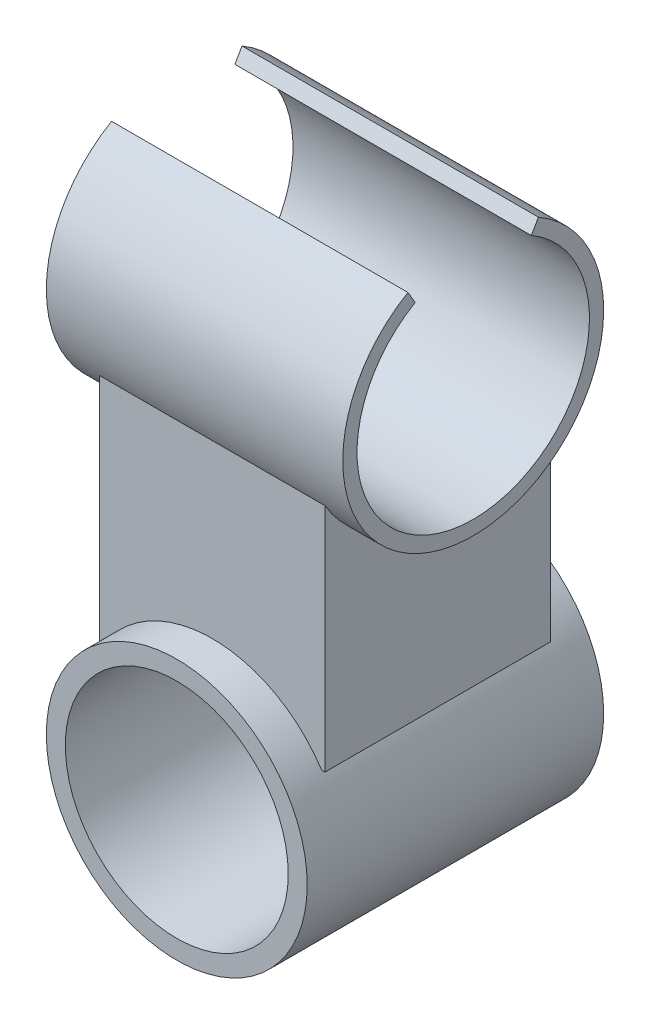
ISO-10303-21;
HEADER;
FILE_DESCRIPTION(('STEP AP214'),'2;1');
FILE_NAME('part.step','',(''),(''),'','','');
FILE_SCHEMA(('AUTOMOTIVE_DESIGN { 1 0 10303 214 1 1 1 1 }'));
ENDSEC;
DATA;
#1=APPLICATION_CONTEXT('core data for automotive mechanical design processes');
#2=APPLICATION_PROTOCOL_DEFINITION('international standard','automotive_design',2000,#1);
#3=PRODUCT_CONTEXT('',#1,'mechanical');
#4=PRODUCT('Part','Part','',(#3));
#5=PRODUCT_RELATED_PRODUCT_CATEGORY('part','',(#4));
#6=PRODUCT_DEFINITION_FORMATION('','',#4);
#7=PRODUCT_DEFINITION_CONTEXT('part definition',#1,'design');
#8=PRODUCT_DEFINITION('design','',#6,#7);
#9=PRODUCT_DEFINITION_SHAPE('','',#8);
#10=(LENGTH_UNIT() NAMED_UNIT(*) SI_UNIT(.MILLI.,.METRE.));
#11=(NAMED_UNIT(*) PLANE_ANGLE_UNIT() SI_UNIT($,.RADIAN.));
#12=(NAMED_UNIT(*) SI_UNIT($,.STERADIAN.) SOLID_ANGLE_UNIT());
#13=UNCERTAINTY_MEASURE_WITH_UNIT(LENGTH_MEASURE(1.E-05),#10,'distance_accuracy_value','');
#14=(GEOMETRIC_REPRESENTATION_CONTEXT(3) GLOBAL_UNCERTAINTY_ASSIGNED_CONTEXT((#13)) GLOBAL_UNIT_ASSIGNED_CONTEXT((#10,
#11,#12)) REPRESENTATION_CONTEXT('',''));
#15=CARTESIAN_POINT('',(0.,0.,0.));
#16=DIRECTION('',(0.,0.,1.));
#17=DIRECTION('',(1.,0.,0.));
#18=AXIS2_PLACEMENT_3D('',#15,#16,#17);
#19=CARTESIAN_POINT('',(0.,-25.,0.));
#20=DIRECTION('',(0.,-1.,0.));
#21=DIRECTION('',(0.,0.,-1.));
#22=AXIS2_PLACEMENT_3D('',#19,#20,#21);
#23=PLANE('',#22);
#24=DIRECTION('',(-1.,0.,0.));
#25=VECTOR('',#24,1.);
#26=CARTESIAN_POINT('',(-9.5,-25.,-9.5));
#27=LINE('',#26,#25);
#28=CARTESIAN_POINT('',(-9.21954445729289,-25.,-9.5));
#29=VERTEX_POINT('',#28);
#30=CARTESIAN_POINT('',(-9.5,-25.,-9.5));
#31=VERTEX_POINT('',#30);
#32=EDGE_CURVE('E334',#29,#31,#27,.T.);
#33=ORIENTED_EDGE('',*,*,#32,.F.);
#34=DIRECTION('',(0.,0.,-1.));
#35=VECTOR('',#34,1.);
#36=CARTESIAN_POINT('',(-9.21954445729289,-25.,12.5));
#37=LINE('',#36,#35);
#38=CARTESIAN_POINT('',(-9.21954445729289,-25.,9.5));
#39=VERTEX_POINT('',#38);
#40=EDGE_CURVE('E11',#29,#39,#37,.F.);
#41=ORIENTED_EDGE('',*,*,#40,.T.);
#42=DIRECTION('',(1.,0.,0.));
#43=VECTOR('',#42,1.);
#44=CARTESIAN_POINT('',(-9.5,-25.,9.5));
#45=LINE('',#44,#43);
#46=CARTESIAN_POINT('',(-9.5,-25.,9.5));
#47=VERTEX_POINT('',#46);
#48=EDGE_CURVE('E168',#47,#39,#45,.T.);
#49=ORIENTED_EDGE('',*,*,#48,.F.);
#50=DIRECTION('',(0.,0.,1.));
#51=VECTOR('',#50,1.);
#52=CARTESIAN_POINT('',(-9.5,-25.,9.5));
#53=LINE('',#52,#51);
#54=EDGE_CURVE('E177',#31,#47,#53,.T.);
#55=ORIENTED_EDGE('',*,*,#54,.F.);
#56=EDGE_LOOP('',(#33,#41,#49,#55));
#57=FACE_BOUND('',#56,.T.);
#58=ADVANCED_FACE('F46',(#57),#23,.T.);
#59=CARTESIAN_POINT('',(9.21954445729289,-25.,9.5));
#60=VERTEX_POINT('',#59);
#61=CARTESIAN_POINT('',(9.5,-25.,9.5));
#62=VERTEX_POINT('',#61);
#63=EDGE_CURVE('E165',#60,#62,#45,.T.);
#64=ORIENTED_EDGE('',*,*,#63,.F.);
#65=DIRECTION('',(0.,0.,-1.));
#66=VECTOR('',#65,1.);
#67=CARTESIAN_POINT('',(9.21954445729289,-25.,12.5));
#68=LINE('',#67,#66);
#69=CARTESIAN_POINT('',(9.21954445729289,-25.,-9.5));
#70=VERTEX_POINT('',#69);
#71=EDGE_CURVE('E56',#60,#70,#68,.T.);
#72=ORIENTED_EDGE('',*,*,#71,.T.);
#73=CARTESIAN_POINT('',(9.5,-25.,-9.5));
#74=VERTEX_POINT('',#73);
#75=EDGE_CURVE('E183',#74,#70,#27,.T.);
#76=ORIENTED_EDGE('',*,*,#75,.F.);
#77=DIRECTION('',(0.,0.,-1.));
#78=VECTOR('',#77,1.);
#79=CARTESIAN_POINT('',(9.5,-25.,9.5));
#80=LINE('',#79,#78);
#81=EDGE_CURVE('E175',#62,#74,#80,.T.);
#82=ORIENTED_EDGE('',*,*,#81,.F.);
#83=EDGE_LOOP('',(#64,#72,#76,#82));
#84=FACE_BOUND('',#83,.T.);
#85=ADVANCED_FACE('F173',(#84),#23,.T.);
#86=CARTESIAN_POINT('',(12.5,0.,0.));
#87=DIRECTION('',(-1.,0.,0.));
#88=DIRECTION('',(0.,0.,1.));
#89=AXIS2_PLACEMENT_3D('',#86,#87,#88);
#90=CYLINDRICAL_SURFACE('',#89,11.);
#91=DIRECTION('',(-1.,0.,0.));
#92=VECTOR('',#91,1.);
#93=CARTESIAN_POINT('',(12.5,-5.54526825320471,9.5));
#94=LINE('',#93,#92);
#95=CARTESIAN_POINT('',(-9.5,-5.54526825320471,9.5));
#96=VERTEX_POINT('',#95);
#97=CARTESIAN_POINT('',(9.5,-5.54526825320471,9.5));
#98=VERTEX_POINT('',#97);
#99=EDGE_CURVE('E224',#96,#98,#94,.F.);
#100=ORIENTED_EDGE('',*,*,#99,.T.);
#101=CARTESIAN_POINT('',(9.5,0.,0.));
#102=DIRECTION('',(1.,0.,0.));
#103=DIRECTION('',(0.,0.,-1.));
#104=AXIS2_PLACEMENT_3D('',#101,#102,#103);
#105=CIRCLE('',#104,11.);
#106=CARTESIAN_POINT('',(9.5,-5.54526825320471,-9.5));
#107=VERTEX_POINT('',#106);
#108=EDGE_CURVE('E228',#98,#107,#105,.T.);
#109=ORIENTED_EDGE('',*,*,#108,.T.);
#110=DIRECTION('',(-1.,0.,0.));
#111=VECTOR('',#110,1.);
#112=CARTESIAN_POINT('',(12.5,-5.54526825320471,-9.5));
#113=LINE('',#112,#111);
#114=CARTESIAN_POINT('',(-9.5,-5.54526825320471,-9.5));
#115=VERTEX_POINT('',#114);
#116=EDGE_CURVE('E216',#107,#115,#113,.T.);
#117=ORIENTED_EDGE('',*,*,#116,.T.);
#118=CARTESIAN_POINT('',(-9.5,0.,0.));
#119=DIRECTION('',(-1.,0.,0.));
#120=DIRECTION('',(0.,0.,1.));
#121=AXIS2_PLACEMENT_3D('',#118,#119,#120);
#122=CIRCLE('',#121,11.);
#123=EDGE_CURVE('E220',#115,#96,#122,.T.);
#124=ORIENTED_EDGE('',*,*,#123,.T.);
#125=EDGE_LOOP('',(#100,#109,#117,#124));
#126=FACE_BOUND('',#125,.T.);
#127=CARTESIAN_POINT('',(-12.5,0.,0.));
#128=DIRECTION('',(1.,0.,0.));
#129=DIRECTION('',(0.,0.,-1.));
#130=AXIS2_PLACEMENT_3D('',#127,#128,#129);
#131=CIRCLE('',#130,11.);
#132=CARTESIAN_POINT('',(-12.5,9.52627944162886,5.49999999999994));
#133=VERTEX_POINT('',#132);
#134=CARTESIAN_POINT('',(-12.5,9.52627944162882,-5.50000000000001));
#135=VERTEX_POINT('',#134);
#136=EDGE_CURVE('E232',#133,#135,#131,.T.);
#137=ORIENTED_EDGE('',*,*,#136,.T.);
#138=DIRECTION('',(-1.,0.,0.));
#139=VECTOR('',#138,1.);
#140=CARTESIAN_POINT('',(12.5,9.52627944162882,-5.50000000000001));
#141=LINE('',#140,#139);
#142=CARTESIAN_POINT('',(12.5,9.52627944162882,-5.50000000000001));
#143=VERTEX_POINT('',#142);
#144=EDGE_CURVE('E160',#143,#135,#141,.T.);
#145=ORIENTED_EDGE('',*,*,#144,.F.);
#146=CARTESIAN_POINT('',(12.5,0.,0.));
#147=DIRECTION('',(1.,0.,0.));
#148=DIRECTION('',(0.,0.,-1.));
#149=AXIS2_PLACEMENT_3D('',#146,#147,#148);
#150=CIRCLE('',#149,11.);
#151=CARTESIAN_POINT('',(12.5,9.52627944162886,5.49999999999994));
#152=VERTEX_POINT('',#151);
#153=EDGE_CURVE('E233',#152,#143,#150,.T.);
#154=ORIENTED_EDGE('',*,*,#153,.F.);
#155=DIRECTION('',(-1.,0.,0.));
#156=VECTOR('',#155,1.);
#157=CARTESIAN_POINT('',(12.5,9.52627944162886,5.49999999999994));
#158=LINE('',#157,#156);
#159=EDGE_CURVE('E247',#152,#133,#158,.T.);
#160=ORIENTED_EDGE('',*,*,#159,.T.);
#161=EDGE_LOOP('',(#137,#145,#154,#160));
#162=FACE_BOUND('',#161,.T.);
#163=ADVANCED_FACE('F48',(#126,#162),#90,.T.);
#164=CARTESIAN_POINT('',(12.5,8.48704895708749,-4.90000000000001));
#165=DIRECTION('',(0.,-0.500000000000001,-0.866025403784438));
#166=DIRECTION('',(0.,0.866025403784438,-0.500000000000001));
#167=AXIS2_PLACEMENT_3D('',#164,#165,#166);
#168=PLANE('',#167);
#169=DIRECTION('',(0.,-0.866025403784438,0.500000000000001));
#170=VECTOR('',#169,1.);
#171=CARTESIAN_POINT('',(-12.5,8.48704895708749,-4.90000000000001));
#172=LINE('',#171,#170);
#173=CARTESIAN_POINT('',(-12.5,8.48704895708749,-4.90000000000001));
#174=VERTEX_POINT('',#173);
#175=EDGE_CURVE('E251',#135,#174,#172,.T.);
#176=ORIENTED_EDGE('',*,*,#175,.T.);
#177=DIRECTION('',(-1.,0.,0.));
#178=VECTOR('',#177,1.);
#179=CARTESIAN_POINT('',(12.5,8.48704895708749,-4.90000000000001));
#180=LINE('',#179,#178);
#181=CARTESIAN_POINT('',(12.5,8.48704895708749,-4.90000000000001));
#182=VERTEX_POINT('',#181);
#183=EDGE_CURVE('E266',#182,#174,#180,.T.);
#184=ORIENTED_EDGE('',*,*,#183,.F.);
#185=DIRECTION('',(0.,-0.866025403784438,0.500000000000001));
#186=VECTOR('',#185,1.);
#187=CARTESIAN_POINT('',(12.5,8.48704895708749,-4.90000000000001));
#188=LINE('',#187,#186);
#189=EDGE_CURVE('E237',#143,#182,#188,.T.);
#190=ORIENTED_EDGE('',*,*,#189,.F.);
#191=ORIENTED_EDGE('',*,*,#144,.T.);
#192=EDGE_LOOP('',(#176,#184,#190,#191));
#193=FACE_BOUND('',#192,.T.);
#194=ADVANCED_FACE('F274',(#193),#168,.F.);
#195=CARTESIAN_POINT('',(12.5,0.,0.));
#196=DIRECTION('',(-1.,0.,0.));
#197=DIRECTION('',(0.,0.,1.));
#198=AXIS2_PLACEMENT_3D('',#195,#196,#197);
#199=CYLINDRICAL_SURFACE('',#198,9.8);
#200=CARTESIAN_POINT('',(-12.5,0.,0.));
#201=DIRECTION('',(-1.,0.,0.));
#202=DIRECTION('',(0.,0.,-1.));
#203=AXIS2_PLACEMENT_3D('',#200,#201,#202);
#204=CIRCLE('',#203,9.8);
#205=CARTESIAN_POINT('',(-12.5,8.48704895708753,4.89999999999995));
#206=VERTEX_POINT('',#205);
#207=EDGE_CURVE('E254',#174,#206,#204,.T.);
#208=ORIENTED_EDGE('',*,*,#207,.T.);
#209=DIRECTION('',(-1.,0.,0.));
#210=VECTOR('',#209,1.);
#211=CARTESIAN_POINT('',(12.5,8.48704895708753,4.89999999999995));
#212=LINE('',#211,#210);
#213=CARTESIAN_POINT('',(12.5,8.48704895708753,4.89999999999995));
#214=VERTEX_POINT('',#213);
#215=EDGE_CURVE('E262',#214,#206,#212,.T.);
#216=ORIENTED_EDGE('',*,*,#215,.F.);
#217=CARTESIAN_POINT('',(12.5,0.,0.));
#218=DIRECTION('',(-1.,0.,0.));
#219=DIRECTION('',(0.,0.,-1.));
#220=AXIS2_PLACEMENT_3D('',#217,#218,#219);
#221=CIRCLE('',#220,9.8);
#222=EDGE_CURVE('E241',#182,#214,#221,.T.);
#223=ORIENTED_EDGE('',*,*,#222,.F.);
#224=ORIENTED_EDGE('',*,*,#183,.T.);
#225=EDGE_LOOP('',(#208,#216,#223,#224));
#226=FACE_BOUND('',#225,.T.);
#227=ADVANCED_FACE('F286',(#226),#199,.F.);
#228=CARTESIAN_POINT('',(12.5,9.52627944162886,5.49999999999994));
#229=DIRECTION('',(0.,-0.499999999999994,0.866025403784442));
#230=DIRECTION('',(0.,-0.866025403784442,-0.499999999999995));
#231=AXIS2_PLACEMENT_3D('',#228,#229,#230);
#232=PLANE('',#231);
#233=DIRECTION('',(0.,0.866025403784442,0.499999999999994));
#234=VECTOR('',#233,1.);
#235=CARTESIAN_POINT('',(-12.5,9.52627944162886,5.49999999999994));
#236=LINE('',#235,#234);
#237=EDGE_CURVE('E238',#206,#133,#236,.T.);
#238=ORIENTED_EDGE('',*,*,#237,.T.);
#239=ORIENTED_EDGE('',*,*,#159,.F.);
#240=DIRECTION('',(0.,0.866025403784442,0.499999999999994));
#241=VECTOR('',#240,1.);
#242=CARTESIAN_POINT('',(12.5,9.52627944162886,5.49999999999994));
#243=LINE('',#242,#241);
#244=EDGE_CURVE('E244',#214,#152,#243,.T.);
#245=ORIENTED_EDGE('',*,*,#244,.F.);
#246=ORIENTED_EDGE('',*,*,#215,.T.);
#247=EDGE_LOOP('',(#238,#239,#245,#246));
#248=FACE_BOUND('',#247,.T.);
#249=ADVANCED_FACE('F290',(#248),#232,.F.);
#250=CARTESIAN_POINT('',(12.5,0.,0.));
#251=DIRECTION('',(1.,0.,0.));
#252=DIRECTION('',(0.,0.,-1.));
#253=AXIS2_PLACEMENT_3D('',#250,#251,#252);
#254=PLANE('',#253);
#255=ORIENTED_EDGE('',*,*,#153,.T.);
#256=ORIENTED_EDGE('',*,*,#189,.T.);
#257=ORIENTED_EDGE('',*,*,#222,.T.);
#258=ORIENTED_EDGE('',*,*,#244,.T.);
#259=EDGE_LOOP('',(#255,#256,#257,#258));
#260=FACE_BOUND('',#259,.T.);
#261=ADVANCED_FACE('F292',(#260),#254,.T.);
#262=CARTESIAN_POINT('',(-12.5,0.,0.));
#263=DIRECTION('',(1.,0.,0.));
#264=DIRECTION('',(0.,0.,-1.));
#265=AXIS2_PLACEMENT_3D('',#262,#263,#264);
#266=PLANE('',#265);
#267=ORIENTED_EDGE('',*,*,#136,.F.);
#268=ORIENTED_EDGE('',*,*,#237,.F.);
#269=ORIENTED_EDGE('',*,*,#207,.F.);
#270=ORIENTED_EDGE('',*,*,#175,.F.);
#271=EDGE_LOOP('',(#267,#268,#269,#270));
#272=FACE_BOUND('',#271,.T.);
#273=ADVANCED_FACE('F282',(#272),#266,.F.);
#274=CARTESIAN_POINT('',(9.5,-25.,9.5));
#275=DIRECTION('',(1.,0.,0.));
#276=DIRECTION('',(0.,0.,-1.));
#277=AXIS2_PLACEMENT_3D('',#274,#275,#276);
#278=PLANE('',#277);
#279=ORIENTED_EDGE('',*,*,#108,.F.);
#280=DIRECTION('',(0.,1.,0.));
#281=VECTOR('',#280,1.);
#282=CARTESIAN_POINT('',(9.5,-25.,9.5));
#283=LINE('',#282,#281);
#284=EDGE_CURVE('E187',#62,#98,#283,.T.);
#285=ORIENTED_EDGE('',*,*,#284,.F.);
#286=ORIENTED_EDGE('',*,*,#81,.T.);
#287=DIRECTION('',(0.,1.,0.));
#288=VECTOR('',#287,1.);
#289=CARTESIAN_POINT('',(9.5,-25.,-9.5));
#290=LINE('',#289,#288);
#291=EDGE_CURVE('E181',#74,#107,#290,.T.);
#292=ORIENTED_EDGE('',*,*,#291,.T.);
#293=EDGE_LOOP('',(#279,#285,#286,#292));
#294=FACE_BOUND('',#293,.T.);
#295=ADVANCED_FACE('F299',(#294),#278,.T.);
#296=CARTESIAN_POINT('',(-9.5,-25.,9.5));
#297=DIRECTION('',(0.,0.,1.));
#298=DIRECTION('',(1.,0.,0.));
#299=AXIS2_PLACEMENT_3D('',#296,#297,#298);
#300=PLANE('',#299);
#301=ORIENTED_EDGE('',*,*,#48,.T.);
#302=CARTESIAN_POINT('',(0.,-31.,9.5));
#303=DIRECTION('',(0.,0.,1.));
#304=DIRECTION('',(1.,0.,0.));
#305=AXIS2_PLACEMENT_3D('',#302,#303,#304);
#306=CIRCLE('',#305,11.);
#307=EDGE_CURVE('E152',#39,#60,#306,.F.);
#308=ORIENTED_EDGE('',*,*,#307,.T.);
#309=ORIENTED_EDGE('',*,*,#63,.T.);
#310=ORIENTED_EDGE('',*,*,#284,.T.);
#311=ORIENTED_EDGE('',*,*,#99,.F.);
#312=DIRECTION('',(0.,1.,0.));
#313=VECTOR('',#312,1.);
#314=CARTESIAN_POINT('',(-9.5,-25.,9.5));
#315=LINE('',#314,#313);
#316=EDGE_CURVE('E191',#47,#96,#315,.T.);
#317=ORIENTED_EDGE('',*,*,#316,.F.);
#318=EDGE_LOOP('',(#301,#308,#309,#310,#311,#317));
#319=FACE_BOUND('',#318,.T.);
#320=ADVANCED_FACE('F163',(#319),#300,.T.);
#321=CARTESIAN_POINT('',(-9.5,-25.,9.5));
#322=DIRECTION('',(-1.,0.,0.));
#323=DIRECTION('',(0.,0.,1.));
#324=AXIS2_PLACEMENT_3D('',#321,#322,#323);
#325=PLANE('',#324);
#326=ORIENTED_EDGE('',*,*,#123,.F.);
#327=DIRECTION('',(0.,1.,0.));
#328=VECTOR('',#327,1.);
#329=CARTESIAN_POINT('',(-9.5,-25.,-9.5));
#330=LINE('',#329,#328);
#331=EDGE_CURVE('E195',#31,#115,#330,.T.);
#332=ORIENTED_EDGE('',*,*,#331,.F.);
#333=ORIENTED_EDGE('',*,*,#54,.T.);
#334=ORIENTED_EDGE('',*,*,#316,.T.);
#335=EDGE_LOOP('',(#326,#332,#333,#334));
#336=FACE_BOUND('',#335,.T.);
#337=ADVANCED_FACE('F317',(#336),#325,.T.);
#338=CARTESIAN_POINT('',(-9.5,-25.,-9.5));
#339=DIRECTION('',(0.,0.,-1.));
#340=DIRECTION('',(-1.,0.,0.));
#341=AXIS2_PLACEMENT_3D('',#338,#339,#340);
#342=PLANE('',#341);
#343=ORIENTED_EDGE('',*,*,#75,.T.);
#344=CARTESIAN_POINT('',(0.,-31.,-9.5));
#345=DIRECTION('',(0.,0.,-1.));
#346=DIRECTION('',(-1.,0.,0.));
#347=AXIS2_PLACEMENT_3D('',#344,#345,#346);
#348=CIRCLE('',#347,11.);
#349=EDGE_CURVE('E154',#70,#29,#348,.F.);
#350=ORIENTED_EDGE('',*,*,#349,.T.);
#351=ORIENTED_EDGE('',*,*,#32,.T.);
#352=ORIENTED_EDGE('',*,*,#331,.T.);
#353=ORIENTED_EDGE('',*,*,#116,.F.);
#354=ORIENTED_EDGE('',*,*,#291,.F.);
#355=EDGE_LOOP('',(#343,#350,#351,#352,#353,#354));
#356=FACE_BOUND('',#355,.T.);
#357=ADVANCED_FACE('F320',(#356),#342,.T.);
#358=CARTESIAN_POINT('',(0.,-31.,12.5));
#359=DIRECTION('',(0.,0.,-1.));
#360=DIRECTION('',(-1.,0.,0.));
#361=AXIS2_PLACEMENT_3D('',#358,#359,#360);
#362=CYLINDRICAL_SURFACE('',#361,9.4);
#363=CARTESIAN_POINT('',(0.,-31.,12.5));
#364=DIRECTION('',(0.,0.,1.));
#365=DIRECTION('',(1.,0.,0.));
#366=AXIS2_PLACEMENT_3D('',#363,#364,#365);
#367=CIRCLE('',#366,9.4);
#368=CARTESIAN_POINT('',(9.4,-31.,12.5));
#369=VERTEX_POINT('',#368);
#370=EDGE_CURVE('E420',#369,#369,#367,.T.);
#371=ORIENTED_EDGE('',*,*,#370,.T.);
#372=EDGE_LOOP('',(#371));
#373=FACE_BOUND('',#372,.T.);
#374=CARTESIAN_POINT('',(0.,-31.,-12.5));
#375=DIRECTION('',(0.,0.,1.));
#376=DIRECTION('',(1.,0.,0.));
#377=AXIS2_PLACEMENT_3D('',#374,#375,#376);
#378=CIRCLE('',#377,9.4);
#379=CARTESIAN_POINT('',(9.4,-31.,-12.5));
#380=VERTEX_POINT('',#379);
#381=EDGE_CURVE('E422',#380,#380,#378,.T.);
#382=ORIENTED_EDGE('',*,*,#381,.F.);
#383=EDGE_LOOP('',(#382));
#384=FACE_BOUND('',#383,.T.);
#385=ADVANCED_FACE('F323',(#373,#384),#362,.F.);
#386=CARTESIAN_POINT('',(0.,-31.,12.5));
#387=DIRECTION('',(0.,0.,-1.));
#388=DIRECTION('',(-1.,0.,0.));
#389=AXIS2_PLACEMENT_3D('',#386,#387,#388);
#390=CYLINDRICAL_SURFACE('',#389,11.);
#391=ORIENTED_EDGE('',*,*,#40,.F.);
#392=ORIENTED_EDGE('',*,*,#349,.F.);
#393=ORIENTED_EDGE('',*,*,#71,.F.);
#394=ORIENTED_EDGE('',*,*,#307,.F.);
#395=EDGE_LOOP('',(#391,#392,#393,#394));
#396=FACE_BOUND('',#395,.T.);
#397=CARTESIAN_POINT('',(0.,-31.,12.5));
#398=DIRECTION('',(0.,0.,1.));
#399=DIRECTION('',(1.,0.,0.));
#400=AXIS2_PLACEMENT_3D('',#397,#398,#399);
#401=CIRCLE('',#400,11.);
#402=CARTESIAN_POINT('',(11.,-31.,12.5));
#403=VERTEX_POINT('',#402);
#404=EDGE_CURVE('E336',#403,#403,#401,.T.);
#405=ORIENTED_EDGE('',*,*,#404,.F.);
#406=EDGE_LOOP('',(#405));
#407=FACE_BOUND('',#406,.T.);
#408=CARTESIAN_POINT('',(0.,-31.,-12.5));
#409=DIRECTION('',(0.,0.,1.));
#410=DIRECTION('',(1.,0.,0.));
#411=AXIS2_PLACEMENT_3D('',#408,#409,#410);
#412=CIRCLE('',#411,11.);
#413=CARTESIAN_POINT('',(11.,-31.,-12.5));
#414=VERTEX_POINT('',#413);
#415=EDGE_CURVE('E340',#414,#414,#412,.T.);
#416=ORIENTED_EDGE('',*,*,#415,.T.);
#417=EDGE_LOOP('',(#416));
#418=FACE_BOUND('',#417,.T.);
#419=ADVANCED_FACE('F150',(#396,#407,#418),#390,.T.);
#420=CARTESIAN_POINT('',(0.,-31.,-12.5));
#421=DIRECTION('',(0.,0.,1.));
#422=DIRECTION('',(1.,0.,0.));
#423=AXIS2_PLACEMENT_3D('',#420,#421,#422);
#424=PLANE('',#423);
#425=ORIENTED_EDGE('',*,*,#415,.F.);
#426=EDGE_LOOP('',(#425));
#427=FACE_BOUND('',#426,.T.);
#428=ORIENTED_EDGE('',*,*,#381,.T.);
#429=EDGE_LOOP('',(#428));
#430=FACE_BOUND('',#429,.T.);
#431=ADVANCED_FACE('F399',(#427,#430),#424,.F.);
#432=CARTESIAN_POINT('',(0.,-31.,12.5));
#433=DIRECTION('',(0.,0.,1.));
#434=DIRECTION('',(1.,0.,0.));
#435=AXIS2_PLACEMENT_3D('',#432,#433,#434);
#436=PLANE('',#435);
#437=ORIENTED_EDGE('',*,*,#404,.T.);
#438=EDGE_LOOP('',(#437));
#439=FACE_BOUND('',#438,.T.);
#440=ORIENTED_EDGE('',*,*,#370,.F.);
#441=EDGE_LOOP('',(#440));
#442=FACE_BOUND('',#441,.T.);
#443=ADVANCED_FACE('F403',(#439,#442),#436,.T.);
#444=CLOSED_SHELL('',(#58,#85,#163,#194,#227,#249,#261,#273,#295,#320,#337,#357,#385,#419,#431,#443));
#445=CARTESIAN_POINT('',(0.,-31.,-7.9));
#446=DIRECTION('',(0.,0.,-1.));
#447=DIRECTION('',(-1.,0.,0.));
#448=AXIS2_PLACEMENT_3D('',#445,#446,#447);
#449=CIRCLE('',#448,11.);
#450=CARTESIAN_POINT('',(7.9,-23.3455895066962,-7.9));
#451=VERTEX_POINT('',#450);
#452=CARTESIAN_POINT('',(-7.9,-23.3455895066962,-7.9));
#453=VERTEX_POINT('',#452);
#454=EDGE_CURVE('E70',#451,#453,#449,.F.);
#455=ORIENTED_EDGE('',*,*,#454,.T.);
#456=DIRECTION('',(0.,0.,-1.));
#457=VECTOR('',#456,1.);
#458=CARTESIAN_POINT('',(-7.9,-23.3455895066962,12.5));
#459=LINE('',#458,#457);
#460=CARTESIAN_POINT('',(-7.9,-23.3455895066962,7.9));
#461=VERTEX_POINT('',#460);
#462=EDGE_CURVE('E63',#453,#461,#459,.F.);
#463=ORIENTED_EDGE('',*,*,#462,.T.);
#464=CARTESIAN_POINT('',(0.,-31.,7.9));
#465=DIRECTION('',(0.,0.,1.));
#466=DIRECTION('',(1.,0.,0.));
#467=AXIS2_PLACEMENT_3D('',#464,#465,#466);
#468=CIRCLE('',#467,11.);
#469=CARTESIAN_POINT('',(7.9,-23.3455895066962,7.9));
#470=VERTEX_POINT('',#469);
#471=EDGE_CURVE('E170',#461,#470,#468,.F.);
#472=ORIENTED_EDGE('',*,*,#471,.T.);
#473=DIRECTION('',(0.,0.,-1.));
#474=VECTOR('',#473,1.);
#475=CARTESIAN_POINT('',(7.9,-23.3455895066962,12.5));
#476=LINE('',#475,#474);
#477=EDGE_CURVE('E347',#470,#451,#476,.T.);
#478=ORIENTED_EDGE('',*,*,#477,.T.);
#479=EDGE_LOOP('',(#455,#463,#472,#478));
#480=FACE_BOUND('',#479,.T.);
#481=ADVANCED_FACE('F380',(#480),#390,.T.);
#482=CARTESIAN_POINT('',(-7.9,0.,0.));
#483=DIRECTION('',(-1.,0.,0.));
#484=DIRECTION('',(0.,0.,1.));
#485=AXIS2_PLACEMENT_3D('',#482,#483,#484);
#486=CIRCLE('',#485,11.);
#487=CARTESIAN_POINT('',(-7.9,-7.65441049330384,-7.9));
#488=VERTEX_POINT('',#487);
#489=CARTESIAN_POINT('',(-7.9,-7.65441049330384,7.9));
#490=VERTEX_POINT('',#489);
#491=EDGE_CURVE('E212',#488,#490,#486,.T.);
#492=ORIENTED_EDGE('',*,*,#491,.F.);
#493=DIRECTION('',(-1.,0.,0.));
#494=VECTOR('',#493,1.);
#495=CARTESIAN_POINT('',(12.5,-7.65441049330384,-7.9));
#496=LINE('',#495,#494);
#497=CARTESIAN_POINT('',(7.9,-7.65441049330384,-7.9));
#498=VERTEX_POINT('',#497);
#499=EDGE_CURVE('E208',#498,#488,#496,.T.);
#500=ORIENTED_EDGE('',*,*,#499,.F.);
#501=CARTESIAN_POINT('',(7.9,0.,0.));
#502=DIRECTION('',(1.,0.,0.));
#503=DIRECTION('',(0.,0.,-1.));
#504=AXIS2_PLACEMENT_3D('',#501,#502,#503);
#505=CIRCLE('',#504,11.);
#506=CARTESIAN_POINT('',(7.9,-7.65441049330384,7.9));
#507=VERTEX_POINT('',#506);
#508=EDGE_CURVE('E204',#507,#498,#505,.T.);
#509=ORIENTED_EDGE('',*,*,#508,.F.);
#510=DIRECTION('',(-1.,0.,0.));
#511=VECTOR('',#510,1.);
#512=CARTESIAN_POINT('',(12.5,-7.65441049330384,7.9));
#513=LINE('',#512,#511);
#514=EDGE_CURVE('E190',#490,#507,#513,.F.);
#515=ORIENTED_EDGE('',*,*,#514,.F.);
#516=EDGE_LOOP('',(#492,#500,#509,#515));
#517=FACE_BOUND('',#516,.T.);
#518=ADVANCED_FACE('F376',(#517),#90,.T.);
#519=CARTESIAN_POINT('',(-7.9,-25.,7.9));
#520=DIRECTION('',(0.,0.,1.));
#521=DIRECTION('',(1.,0.,0.));
#522=AXIS2_PLACEMENT_3D('',#519,#520,#521);
#523=PLANE('',#522);
#524=ORIENTED_EDGE('',*,*,#471,.F.);
#525=DIRECTION('',(0.,1.,0.));
#526=VECTOR('',#525,1.);
#527=CARTESIAN_POINT('',(-7.9,-25.,7.9));
#528=LINE('',#527,#526);
#529=EDGE_CURVE('E355',#461,#490,#528,.T.);
#530=ORIENTED_EDGE('',*,*,#529,.T.);
#531=ORIENTED_EDGE('',*,*,#514,.T.);
#532=DIRECTION('',(0.,1.,0.));
#533=VECTOR('',#532,1.);
#534=CARTESIAN_POINT('',(7.9,-25.,7.9));
#535=LINE('',#534,#533);
#536=EDGE_CURVE('E362',#470,#507,#535,.T.);
#537=ORIENTED_EDGE('',*,*,#536,.F.);
#538=EDGE_LOOP('',(#524,#530,#531,#537));
#539=FACE_BOUND('',#538,.T.);
#540=ADVANCED_FACE('F372',(#539),#523,.F.);
#541=CARTESIAN_POINT('',(7.9,-25.,7.9));
#542=DIRECTION('',(1.,0.,0.));
#543=DIRECTION('',(0.,0.,-1.));
#544=AXIS2_PLACEMENT_3D('',#541,#542,#543);
#545=PLANE('',#544);
#546=ORIENTED_EDGE('',*,*,#477,.F.);
#547=ORIENTED_EDGE('',*,*,#536,.T.);
#548=ORIENTED_EDGE('',*,*,#508,.T.);
#549=DIRECTION('',(0.,1.,0.));
#550=VECTOR('',#549,1.);
#551=CARTESIAN_POINT('',(7.9,-25.,-7.9));
#552=LINE('',#551,#550);
#553=EDGE_CURVE('E359',#451,#498,#552,.T.);
#554=ORIENTED_EDGE('',*,*,#553,.F.);
#555=EDGE_LOOP('',(#546,#547,#548,#554));
#556=FACE_BOUND('',#555,.T.);
#557=ADVANCED_FACE('F383',(#556),#545,.F.);
#558=CARTESIAN_POINT('',(-7.9,-25.,-7.9));
#559=DIRECTION('',(0.,0.,-1.));
#560=DIRECTION('',(-1.,0.,0.));
#561=AXIS2_PLACEMENT_3D('',#558,#559,#560);
#562=PLANE('',#561);
#563=ORIENTED_EDGE('',*,*,#454,.F.);
#564=ORIENTED_EDGE('',*,*,#553,.T.);
#565=ORIENTED_EDGE('',*,*,#499,.T.);
#566=DIRECTION('',(0.,1.,0.));
#567=VECTOR('',#566,1.);
#568=CARTESIAN_POINT('',(-7.9,-25.,-7.9));
#569=LINE('',#568,#567);
#570=EDGE_CURVE('E356',#453,#488,#569,.T.);
#571=ORIENTED_EDGE('',*,*,#570,.F.);
#572=EDGE_LOOP('',(#563,#564,#565,#571));
#573=FACE_BOUND('',#572,.T.);
#574=ADVANCED_FACE('F378',(#573),#562,.F.);
#575=CARTESIAN_POINT('',(-7.9,-25.,7.9));
#576=DIRECTION('',(-1.,0.,0.));
#577=DIRECTION('',(0.,0.,1.));
#578=AXIS2_PLACEMENT_3D('',#575,#576,#577);
#579=PLANE('',#578);
#580=ORIENTED_EDGE('',*,*,#462,.F.);
#581=ORIENTED_EDGE('',*,*,#570,.T.);
#582=ORIENTED_EDGE('',*,*,#491,.T.);
#583=ORIENTED_EDGE('',*,*,#529,.F.);
#584=EDGE_LOOP('',(#580,#581,#582,#583));
#585=FACE_BOUND('',#584,.T.);
#586=ADVANCED_FACE('F313',(#585),#579,.F.);
#587=CLOSED_SHELL('',(#481,#518,#540,#557,#574,#586));
#588=ORIENTED_CLOSED_SHELL('',*,#587,.T.);
#589=BREP_WITH_VOIDS('B2',#444,(#588));
#590=ADVANCED_BREP_SHAPE_REPRESENTATION('',(#18,#589),#14);
#591=SHAPE_DEFINITION_REPRESENTATION(#9,#590);
ENDSEC;
END-ISO-10303-21;
